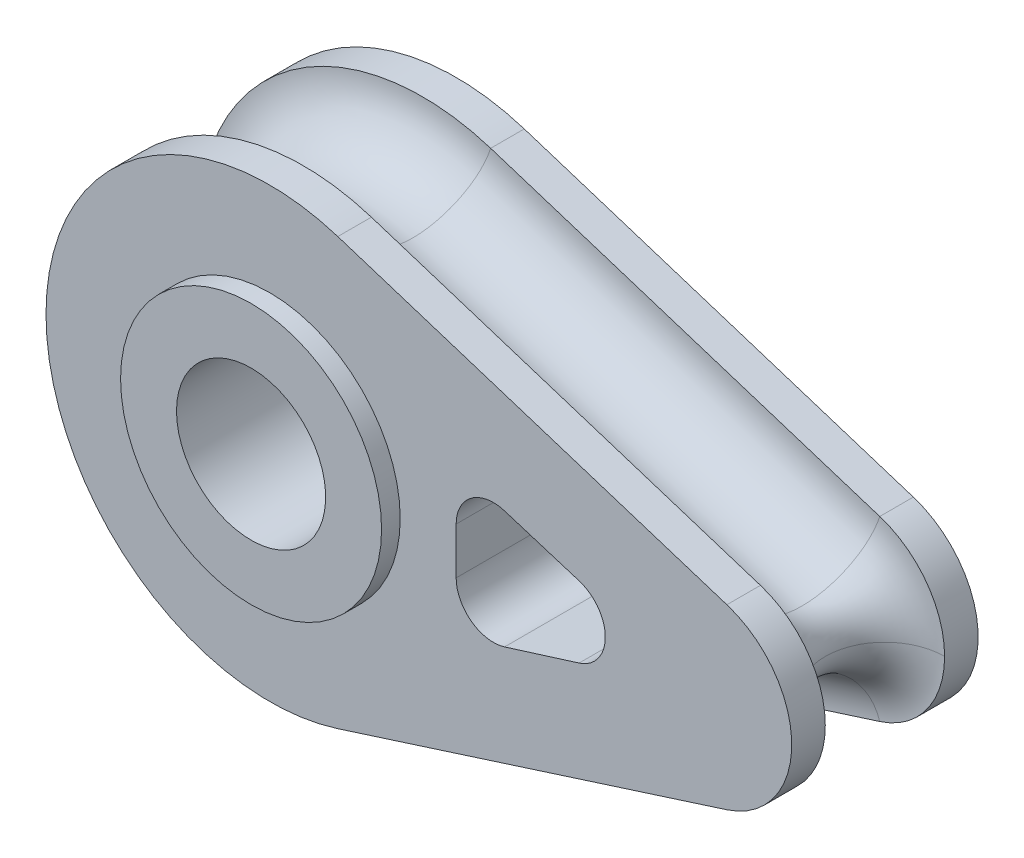
ISO-10303-21;
HEADER;
FILE_DESCRIPTION(('STEP AP214'),'2;1');
FILE_NAME('part.step','',(''),(''),'','','');
FILE_SCHEMA(('AUTOMOTIVE_DESIGN { 1 0 10303 214 1 1 1 1 }'));
ENDSEC;
DATA;
#1=APPLICATION_CONTEXT('core data for automotive mechanical design processes');
#2=APPLICATION_PROTOCOL_DEFINITION('international standard','automotive_design',2000,#1);
#3=PRODUCT_CONTEXT('',#1,'mechanical');
#4=PRODUCT('Part','Part','',(#3));
#5=PRODUCT_RELATED_PRODUCT_CATEGORY('part','',(#4));
#6=PRODUCT_DEFINITION_FORMATION('','',#4);
#7=PRODUCT_DEFINITION_CONTEXT('part definition',#1,'design');
#8=PRODUCT_DEFINITION('design','',#6,#7);
#9=PRODUCT_DEFINITION_SHAPE('','',#8);
#10=(LENGTH_UNIT() NAMED_UNIT(*) SI_UNIT(.MILLI.,.METRE.));
#11=(NAMED_UNIT(*) PLANE_ANGLE_UNIT() SI_UNIT($,.RADIAN.));
#12=(NAMED_UNIT(*) SI_UNIT($,.STERADIAN.) SOLID_ANGLE_UNIT());
#13=UNCERTAINTY_MEASURE_WITH_UNIT(LENGTH_MEASURE(1.E-05),#10,'distance_accuracy_value','');
#14=(GEOMETRIC_REPRESENTATION_CONTEXT(3) GLOBAL_UNCERTAINTY_ASSIGNED_CONTEXT((#13)) GLOBAL_UNIT_ASSIGNED_CONTEXT((#10,
#11,#12)) REPRESENTATION_CONTEXT('',''));
#15=CARTESIAN_POINT('',(0.,0.,0.));
#16=DIRECTION('',(0.,0.,1.));
#17=DIRECTION('',(1.,0.,0.));
#18=AXIS2_PLACEMENT_3D('',#15,#16,#17);
#19=CARTESIAN_POINT('',(0.,0.,50.));
#20=DIRECTION('',(0.,0.,-1.));
#21=DIRECTION('',(-1.,0.,0.));
#22=AXIS2_PLACEMENT_3D('',#19,#20,#21);
#23=CYLINDRICAL_SURFACE('',#22,60.);
#24=CARTESIAN_POINT('',(0.,0.,41.));
#25=DIRECTION('',(0.,0.,-1.));
#26=DIRECTION('',(-1.,0.,0.));
#27=AXIS2_PLACEMENT_3D('',#24,#25,#26);
#28=CIRCLE('',#27,60.);
#29=CARTESIAN_POINT('',(18.2608695652174,-57.1536581744521,41.));
#30=VERTEX_POINT('',#29);
#31=CARTESIAN_POINT('',(18.2608695652174,57.1536581744521,41.));
#32=VERTEX_POINT('',#31);
#33=EDGE_CURVE('E153',#30,#32,#28,.T.);
#34=ORIENTED_EDGE('',*,*,#33,.F.);
#35=DIRECTION('',(0.,0.,-1.));
#36=VECTOR('',#35,1.);
#37=CARTESIAN_POINT('',(18.2608695652174,-57.1536581744521,50.));
#38=LINE('',#37,#36);
#39=CARTESIAN_POINT('',(18.2608695652174,-57.1536581744521,50.));
#40=VERTEX_POINT('',#39);
#41=EDGE_CURVE('E178',#40,#30,#38,.T.);
#42=ORIENTED_EDGE('',*,*,#41,.F.);
#43=CARTESIAN_POINT('',(0.,0.,50.));
#44=DIRECTION('',(0.,0.,1.));
#45=DIRECTION('',(1.,0.,0.));
#46=AXIS2_PLACEMENT_3D('',#43,#44,#45);
#47=CIRCLE('',#46,60.);
#48=CARTESIAN_POINT('',(18.2608695652174,57.1536581744521,50.));
#49=VERTEX_POINT('',#48);
#50=EDGE_CURVE('E237',#49,#40,#47,.T.);
#51=ORIENTED_EDGE('',*,*,#50,.F.);
#52=DIRECTION('',(0.,0.,-1.));
#53=VECTOR('',#52,1.);
#54=CARTESIAN_POINT('',(18.2608695652174,57.1536581744521,50.));
#55=LINE('',#54,#53);
#56=EDGE_CURVE('E255',#49,#32,#55,.T.);
#57=ORIENTED_EDGE('',*,*,#56,.T.);
#58=EDGE_LOOP('',(#34,#42,#51,#57));
#59=FACE_BOUND('',#58,.T.);
#60=ADVANCED_FACE('F39',(#59),#23,.T.);
#61=CARTESIAN_POINT('',(0.,0.,9.00000000000001));
#62=DIRECTION('',(0.,0.,1.));
#63=DIRECTION('',(1.,0.,0.));
#64=AXIS2_PLACEMENT_3D('',#61,#62,#63);
#65=CIRCLE('',#64,60.);
#66=CARTESIAN_POINT('',(18.2608695652174,57.1536581744521,9.00000000000001));
#67=VERTEX_POINT('',#66);
#68=CARTESIAN_POINT('',(18.2608695652174,-57.1536581744521,9.00000000000001));
#69=VERTEX_POINT('',#68);
#70=EDGE_CURVE('E144',#67,#69,#65,.T.);
#71=ORIENTED_EDGE('',*,*,#70,.F.);
#72=CARTESIAN_POINT('',(18.2608695652174,57.1536581744521,0.));
#73=VERTEX_POINT('',#72);
#74=EDGE_CURVE('E235',#67,#73,#55,.T.);
#75=ORIENTED_EDGE('',*,*,#74,.T.);
#76=CARTESIAN_POINT('',(0.,0.,0.));
#77=DIRECTION('',(0.,0.,1.));
#78=DIRECTION('',(1.,0.,0.));
#79=AXIS2_PLACEMENT_3D('',#76,#77,#78);
#80=CIRCLE('',#79,60.);
#81=CARTESIAN_POINT('',(18.2608695652174,-57.1536581744521,0.));
#82=VERTEX_POINT('',#81);
#83=EDGE_CURVE('E176',#73,#82,#80,.T.);
#84=ORIENTED_EDGE('',*,*,#83,.T.);
#85=EDGE_CURVE('E168',#69,#82,#38,.T.);
#86=ORIENTED_EDGE('',*,*,#85,.F.);
#87=EDGE_LOOP('',(#71,#75,#84,#86));
#88=FACE_BOUND('',#87,.T.);
#89=ADVANCED_FACE('F174',(#88),#23,.T.);
#90=CARTESIAN_POINT('',(18.2608695652174,-57.1536581744521,50.));
#91=DIRECTION('',(-0.304347826086957,0.952560969574202,0.));
#92=DIRECTION('',(-0.952560969574202,-0.304347826086957,0.));
#93=AXIS2_PLACEMENT_3D('',#90,#91,#92);
#94=PLANE('',#93);
#95=DIRECTION('',(0.952560969574202,0.304347826086957,0.));
#96=VECTOR('',#95,1.);
#97=CARTESIAN_POINT('',(18.2608695652173,-57.1536581744521,41.));
#98=LINE('',#97,#96);
#99=CARTESIAN_POINT('',(122.608695652174,-23.814024239355,41.));
#100=VERTEX_POINT('',#99);
#101=EDGE_CURVE('E11',#100,#30,#98,.F.);
#102=ORIENTED_EDGE('',*,*,#101,.F.);
#103=DIRECTION('',(0.,0.,-1.));
#104=VECTOR('',#103,1.);
#105=CARTESIAN_POINT('',(122.608695652174,-23.814024239355,50.));
#106=LINE('',#105,#104);
#107=CARTESIAN_POINT('',(122.608695652174,-23.814024239355,50.));
#108=VERTEX_POINT('',#107);
#109=EDGE_CURVE('E179',#108,#100,#106,.T.);
#110=ORIENTED_EDGE('',*,*,#109,.F.);
#111=DIRECTION('',(0.952560969574202,0.304347826086957,0.));
#112=VECTOR('',#111,1.);
#113=CARTESIAN_POINT('',(18.2608695652174,-57.1536581744521,50.));
#114=LINE('',#113,#112);
#115=EDGE_CURVE('E231',#40,#108,#114,.T.);
#116=ORIENTED_EDGE('',*,*,#115,.F.);
#117=ORIENTED_EDGE('',*,*,#41,.T.);
#118=EDGE_LOOP('',(#102,#110,#116,#117));
#119=FACE_BOUND('',#118,.T.);
#120=ADVANCED_FACE('F219',(#119),#94,.F.);
#121=DIRECTION('',(0.952560969574202,0.304347826086957,0.));
#122=VECTOR('',#121,1.);
#123=CARTESIAN_POINT('',(18.2608695652173,-57.1536581744521,9.00000000000001));
#124=LINE('',#123,#122);
#125=CARTESIAN_POINT('',(122.608695652174,-23.814024239355,9.00000000000001));
#126=VERTEX_POINT('',#125);
#127=EDGE_CURVE('E47',#69,#126,#124,.T.);
#128=ORIENTED_EDGE('',*,*,#127,.F.);
#129=ORIENTED_EDGE('',*,*,#85,.T.);
#130=DIRECTION('',(0.952560969574202,0.304347826086957,0.));
#131=VECTOR('',#130,1.);
#132=CARTESIAN_POINT('',(18.2608695652174,-57.1536581744521,0.));
#133=LINE('',#132,#131);
#134=CARTESIAN_POINT('',(122.608695652174,-23.814024239355,0.));
#135=VERTEX_POINT('',#134);
#136=EDGE_CURVE('E243',#82,#135,#133,.T.);
#137=ORIENTED_EDGE('',*,*,#136,.T.);
#138=EDGE_CURVE('E170',#126,#135,#106,.T.);
#139=ORIENTED_EDGE('',*,*,#138,.F.);
#140=EDGE_LOOP('',(#128,#129,#137,#139));
#141=FACE_BOUND('',#140,.T.);
#142=ADVANCED_FACE('F166',(#141),#94,.F.);
#143=CARTESIAN_POINT('',(115.,0.,50.));
#144=DIRECTION('',(0.,0.,-1.));
#145=DIRECTION('',(-1.,0.,0.));
#146=AXIS2_PLACEMENT_3D('',#143,#144,#145);
#147=CYLINDRICAL_SURFACE('',#146,25.);
#148=CARTESIAN_POINT('',(115.,0.,41.));
#149=DIRECTION('',(0.,0.,-1.));
#150=DIRECTION('',(-1.,0.,0.));
#151=AXIS2_PLACEMENT_3D('',#148,#149,#150);
#152=CIRCLE('',#151,25.);
#153=CARTESIAN_POINT('',(122.608695652174,23.814024239355,41.));
#154=VERTEX_POINT('',#153);
#155=CARTESIAN_POINT('',(140.,0.,41.));
#156=VERTEX_POINT('',#155);
#157=EDGE_CURVE('E311',#154,#156,#152,.T.);
#158=ORIENTED_EDGE('',*,*,#157,.F.);
#159=DIRECTION('',(0.,0.,-1.));
#160=VECTOR('',#159,1.);
#161=CARTESIAN_POINT('',(122.608695652174,23.814024239355,50.));
#162=LINE('',#161,#160);
#163=CARTESIAN_POINT('',(122.608695652174,23.814024239355,50.));
#164=VERTEX_POINT('',#163);
#165=EDGE_CURVE('E226',#164,#154,#162,.T.);
#166=ORIENTED_EDGE('',*,*,#165,.F.);
#167=CARTESIAN_POINT('',(115.,0.,50.));
#168=DIRECTION('',(0.,0.,1.));
#169=DIRECTION('',(1.,0.,0.));
#170=AXIS2_PLACEMENT_3D('',#167,#168,#169);
#171=CIRCLE('',#170,25.);
#172=EDGE_CURVE('E224',#108,#164,#171,.T.);
#173=ORIENTED_EDGE('',*,*,#172,.F.);
#174=ORIENTED_EDGE('',*,*,#109,.T.);
#175=CARTESIAN_POINT('',(115.,0.,41.));
#176=DIRECTION('',(0.,0.,-1.));
#177=DIRECTION('',(-1.,0.,0.));
#178=AXIS2_PLACEMENT_3D('',#175,#176,#177);
#179=CIRCLE('',#178,25.);
#180=EDGE_CURVE('E172',#156,#100,#179,.T.);
#181=ORIENTED_EDGE('',*,*,#180,.F.);
#182=EDGE_LOOP('',(#158,#166,#173,#174,#181));
#183=FACE_BOUND('',#182,.T.);
#184=ADVANCED_FACE('F222',(#183),#147,.T.);
#185=CARTESIAN_POINT('',(115.,0.,9.00000000000001));
#186=DIRECTION('',(0.,0.,1.));
#187=DIRECTION('',(1.,0.,0.));
#188=AXIS2_PLACEMENT_3D('',#185,#186,#187);
#189=CIRCLE('',#188,25.);
#190=CARTESIAN_POINT('',(140.,0.,9.00000000000001));
#191=VERTEX_POINT('',#190);
#192=CARTESIAN_POINT('',(122.608695652174,23.814024239355,9.00000000000001));
#193=VERTEX_POINT('',#192);
#194=EDGE_CURVE('E308',#191,#193,#189,.T.);
#195=ORIENTED_EDGE('',*,*,#194,.F.);
#196=CARTESIAN_POINT('',(115.,0.,9.00000000000001));
#197=DIRECTION('',(0.,0.,1.));
#198=DIRECTION('',(1.,0.,0.));
#199=AXIS2_PLACEMENT_3D('',#196,#197,#198);
#200=CIRCLE('',#199,25.);
#201=EDGE_CURVE('E202',#126,#191,#200,.T.);
#202=ORIENTED_EDGE('',*,*,#201,.F.);
#203=ORIENTED_EDGE('',*,*,#138,.T.);
#204=CARTESIAN_POINT('',(115.,0.,0.));
#205=DIRECTION('',(0.,0.,1.));
#206=DIRECTION('',(1.,0.,0.));
#207=AXIS2_PLACEMENT_3D('',#204,#205,#206);
#208=CIRCLE('',#207,25.);
#209=CARTESIAN_POINT('',(122.608695652174,23.814024239355,0.));
#210=VERTEX_POINT('',#209);
#211=EDGE_CURVE('E247',#135,#210,#208,.T.);
#212=ORIENTED_EDGE('',*,*,#211,.T.);
#213=EDGE_CURVE('E258',#193,#210,#162,.T.);
#214=ORIENTED_EDGE('',*,*,#213,.F.);
#215=EDGE_LOOP('',(#195,#202,#203,#212,#214));
#216=FACE_BOUND('',#215,.T.);
#217=ADVANCED_FACE('F272',(#216),#147,.T.);
#218=CARTESIAN_POINT('',(18.2608695652174,57.1536581744521,50.));
#219=DIRECTION('',(-0.304347826086957,-0.952560969574202,0.));
#220=DIRECTION('',(0.952560969574202,-0.304347826086957,0.));
#221=AXIS2_PLACEMENT_3D('',#218,#219,#220);
#222=PLANE('',#221);
#223=DIRECTION('',(-0.952560969574202,0.304347826086956,0.));
#224=VECTOR('',#223,1.);
#225=CARTESIAN_POINT('',(122.608695652174,23.814024239355,41.));
#226=LINE('',#225,#224);
#227=EDGE_CURVE('E199',#32,#154,#226,.F.);
#228=ORIENTED_EDGE('',*,*,#227,.F.);
#229=ORIENTED_EDGE('',*,*,#56,.F.);
#230=DIRECTION('',(-0.952560969574202,0.304347826086957,0.));
#231=VECTOR('',#230,1.);
#232=CARTESIAN_POINT('',(18.2608695652174,57.1536581744521,50.));
#233=LINE('',#232,#231);
#234=EDGE_CURVE('E230',#164,#49,#233,.T.);
#235=ORIENTED_EDGE('',*,*,#234,.F.);
#236=ORIENTED_EDGE('',*,*,#165,.T.);
#237=EDGE_LOOP('',(#228,#229,#235,#236));
#238=FACE_BOUND('',#237,.T.);
#239=ADVANCED_FACE('F395',(#238),#222,.F.);
#240=DIRECTION('',(-0.952560969574202,0.304347826086956,0.));
#241=VECTOR('',#240,1.);
#242=CARTESIAN_POINT('',(122.608695652174,23.814024239355,9.00000000000001));
#243=LINE('',#242,#241);
#244=EDGE_CURVE('E196',#193,#67,#243,.T.);
#245=ORIENTED_EDGE('',*,*,#244,.F.);
#246=ORIENTED_EDGE('',*,*,#213,.T.);
#247=DIRECTION('',(-0.952560969574202,0.304347826086957,0.));
#248=VECTOR('',#247,1.);
#249=CARTESIAN_POINT('',(18.2608695652174,57.1536581744521,0.));
#250=LINE('',#249,#248);
#251=EDGE_CURVE('E251',#210,#73,#250,.T.);
#252=ORIENTED_EDGE('',*,*,#251,.T.);
#253=ORIENTED_EDGE('',*,*,#74,.F.);
#254=EDGE_LOOP('',(#245,#246,#252,#253));
#255=FACE_BOUND('',#254,.T.);
#256=ADVANCED_FACE('F267',(#255),#222,.F.);
#257=CARTESIAN_POINT('',(0.,0.,0.));
#258=DIRECTION('',(0.,0.,1.));
#259=DIRECTION('',(1.,0.,0.));
#260=AXIS2_PLACEMENT_3D('',#257,#258,#259);
#261=PLANE('',#260);
#262=CARTESIAN_POINT('',(60.,-6.25000000000001,0.));
#263=DIRECTION('',(0.,0.,1.));
#264=DIRECTION('',(1.,0.,0.));
#265=AXIS2_PLACEMENT_3D('',#262,#263,#264);
#266=CIRCLE('',#265,10.);
#267=CARTESIAN_POINT('',(50.,-6.25000000000001,0.));
#268=VERTEX_POINT('',#267);
#269=CARTESIAN_POINT('',(62.9827499313595,-15.7947997803503,0.));
#270=VERTEX_POINT('',#269);
#271=EDGE_CURVE('E332',#268,#270,#266,.T.);
#272=ORIENTED_EDGE('',*,*,#271,.T.);
#273=DIRECTION('',(0.95447997803503,0.298274993135947,0.));
#274=VECTOR('',#273,1.);
#275=CARTESIAN_POINT('',(62.9827499313595,-15.7947997803503,0.));
#276=LINE('',#275,#274);
#277=CARTESIAN_POINT('',(82.9827499313595,-9.5447997803503,0.));
#278=VERTEX_POINT('',#277);
#279=EDGE_CURVE('E357',#270,#278,#276,.T.);
#280=ORIENTED_EDGE('',*,*,#279,.T.);
#281=CARTESIAN_POINT('',(80.,0.,0.));
#282=DIRECTION('',(0.,0.,1.));
#283=DIRECTION('',(1.,0.,0.));
#284=AXIS2_PLACEMENT_3D('',#281,#282,#283);
#285=CIRCLE('',#284,10.);
#286=CARTESIAN_POINT('',(82.9827499313595,9.54479978035029,0.));
#287=VERTEX_POINT('',#286);
#288=EDGE_CURVE('E361',#278,#287,#285,.T.);
#289=ORIENTED_EDGE('',*,*,#288,.T.);
#290=DIRECTION('',(-0.95447997803503,0.298274993135947,0.));
#291=VECTOR('',#290,1.);
#292=CARTESIAN_POINT('',(62.9827499313595,15.7947997803503,0.));
#293=LINE('',#292,#291);
#294=CARTESIAN_POINT('',(62.9827499313595,15.7947997803503,0.));
#295=VERTEX_POINT('',#294);
#296=EDGE_CURVE('E365',#287,#295,#293,.T.);
#297=ORIENTED_EDGE('',*,*,#296,.T.);
#298=CARTESIAN_POINT('',(60.,6.24999999999999,0.));
#299=DIRECTION('',(0.,0.,1.));
#300=DIRECTION('',(1.,0.,0.));
#301=AXIS2_PLACEMENT_3D('',#298,#299,#300);
#302=CIRCLE('',#301,10.);
#303=CARTESIAN_POINT('',(50.,6.24999999999999,0.));
#304=VERTEX_POINT('',#303);
#305=EDGE_CURVE('E369',#295,#304,#302,.T.);
#306=ORIENTED_EDGE('',*,*,#305,.T.);
#307=DIRECTION('',(0.,-1.,0.));
#308=VECTOR('',#307,1.);
#309=CARTESIAN_POINT('',(50.,-6.25000000000001,0.));
#310=LINE('',#309,#308);
#311=EDGE_CURVE('E337',#304,#268,#310,.T.);
#312=ORIENTED_EDGE('',*,*,#311,.T.);
#313=EDGE_LOOP('',(#272,#280,#289,#297,#306,#312));
#314=FACE_BOUND('',#313,.T.);
#315=ORIENTED_EDGE('',*,*,#83,.F.);
#316=ORIENTED_EDGE('',*,*,#251,.F.);
#317=ORIENTED_EDGE('',*,*,#211,.F.);
#318=ORIENTED_EDGE('',*,*,#136,.F.);
#319=EDGE_LOOP('',(#315,#316,#317,#318));
#320=FACE_BOUND('',#319,.T.);
#321=CARTESIAN_POINT('',(0.,0.,0.));
#322=DIRECTION('',(0.,0.,1.));
#323=DIRECTION('',(1.,0.,0.));
#324=AXIS2_PLACEMENT_3D('',#321,#322,#323);
#325=CIRCLE('',#324,35.);
#326=CARTESIAN_POINT('',(35.,0.,0.));
#327=VERTEX_POINT('',#326);
#328=EDGE_CURVE('E184',#327,#327,#325,.F.);
#329=ORIENTED_EDGE('',*,*,#328,.F.);
#330=EDGE_LOOP('',(#329));
#331=FACE_BOUND('',#330,.T.);
#332=ADVANCED_FACE('F274',(#314,#320,#331),#261,.F.);
#333=CARTESIAN_POINT('',(0.,0.,50.));
#334=DIRECTION('',(0.,0.,1.));
#335=DIRECTION('',(1.,0.,0.));
#336=AXIS2_PLACEMENT_3D('',#333,#334,#335);
#337=PLANE('',#336);
#338=CARTESIAN_POINT('',(0.,0.,50.));
#339=DIRECTION('',(0.,0.,1.));
#340=DIRECTION('',(1.,0.,0.));
#341=AXIS2_PLACEMENT_3D('',#338,#339,#340);
#342=CIRCLE('',#341,35.);
#343=CARTESIAN_POINT('',(35.,0.,50.));
#344=VERTEX_POINT('',#343);
#345=EDGE_CURVE('E192',#344,#344,#342,.T.);
#346=ORIENTED_EDGE('',*,*,#345,.F.);
#347=EDGE_LOOP('',(#346));
#348=FACE_BOUND('',#347,.T.);
#349=DIRECTION('',(0.95447997803503,0.298274993135947,0.));
#350=VECTOR('',#349,1.);
#351=CARTESIAN_POINT('',(62.9827499313595,-15.7947997803503,50.));
#352=LINE('',#351,#350);
#353=CARTESIAN_POINT('',(62.9827499313595,-15.7947997803503,50.));
#354=VERTEX_POINT('',#353);
#355=CARTESIAN_POINT('',(82.9827499313595,-9.5447997803503,50.));
#356=VERTEX_POINT('',#355);
#357=EDGE_CURVE('E336',#354,#356,#352,.T.);
#358=ORIENTED_EDGE('',*,*,#357,.F.);
#359=CARTESIAN_POINT('',(60.,-6.25000000000001,50.));
#360=DIRECTION('',(0.,0.,1.));
#361=DIRECTION('',(1.,0.,0.));
#362=AXIS2_PLACEMENT_3D('',#359,#360,#361);
#363=CIRCLE('',#362,10.);
#364=CARTESIAN_POINT('',(50.,-6.25000000000001,50.));
#365=VERTEX_POINT('',#364);
#366=EDGE_CURVE('E333',#365,#354,#363,.T.);
#367=ORIENTED_EDGE('',*,*,#366,.F.);
#368=DIRECTION('',(0.,-1.,0.));
#369=VECTOR('',#368,1.);
#370=CARTESIAN_POINT('',(50.,-6.25000000000001,50.));
#371=LINE('',#370,#369);
#372=CARTESIAN_POINT('',(50.,6.24999999999999,50.));
#373=VERTEX_POINT('',#372);
#374=EDGE_CURVE('E350',#373,#365,#371,.T.);
#375=ORIENTED_EDGE('',*,*,#374,.F.);
#376=CARTESIAN_POINT('',(60.,6.24999999999999,50.));
#377=DIRECTION('',(0.,0.,1.));
#378=DIRECTION('',(1.,0.,0.));
#379=AXIS2_PLACEMENT_3D('',#376,#377,#378);
#380=CIRCLE('',#379,10.);
#381=CARTESIAN_POINT('',(62.9827499313595,15.7947997803503,50.));
#382=VERTEX_POINT('',#381);
#383=EDGE_CURVE('E346',#382,#373,#380,.T.);
#384=ORIENTED_EDGE('',*,*,#383,.F.);
#385=DIRECTION('',(-0.95447997803503,0.298274993135947,0.));
#386=VECTOR('',#385,1.);
#387=CARTESIAN_POINT('',(62.9827499313595,15.7947997803503,50.));
#388=LINE('',#387,#386);
#389=CARTESIAN_POINT('',(82.9827499313595,9.54479978035029,50.));
#390=VERTEX_POINT('',#389);
#391=EDGE_CURVE('E343',#390,#382,#388,.T.);
#392=ORIENTED_EDGE('',*,*,#391,.F.);
#393=CARTESIAN_POINT('',(80.,0.,50.));
#394=DIRECTION('',(0.,0.,1.));
#395=DIRECTION('',(1.,0.,0.));
#396=AXIS2_PLACEMENT_3D('',#393,#394,#395);
#397=CIRCLE('',#396,10.);
#398=EDGE_CURVE('E340',#356,#390,#397,.T.);
#399=ORIENTED_EDGE('',*,*,#398,.F.);
#400=EDGE_LOOP('',(#358,#367,#375,#384,#392,#399));
#401=FACE_BOUND('',#400,.T.);
#402=ORIENTED_EDGE('',*,*,#50,.T.);
#403=ORIENTED_EDGE('',*,*,#115,.T.);
#404=ORIENTED_EDGE('',*,*,#172,.T.);
#405=ORIENTED_EDGE('',*,*,#234,.T.);
#406=EDGE_LOOP('',(#402,#403,#404,#405));
#407=FACE_BOUND('',#406,.T.);
#408=ADVANCED_FACE('F277',(#348,#401,#407),#337,.T.);
#409=CARTESIAN_POINT('',(60.,-6.25000000000001,50.));
#410=DIRECTION('',(0.,0.,-1.));
#411=DIRECTION('',(-1.,0.,0.));
#412=AXIS2_PLACEMENT_3D('',#409,#410,#411);
#413=CYLINDRICAL_SURFACE('',#412,10.);
#414=ORIENTED_EDGE('',*,*,#271,.F.);
#415=DIRECTION('',(0.,0.,-1.));
#416=VECTOR('',#415,1.);
#417=CARTESIAN_POINT('',(50.,-6.25000000000001,50.));
#418=LINE('',#417,#416);
#419=EDGE_CURVE('E353',#365,#268,#418,.T.);
#420=ORIENTED_EDGE('',*,*,#419,.F.);
#421=ORIENTED_EDGE('',*,*,#366,.T.);
#422=DIRECTION('',(0.,0.,-1.));
#423=VECTOR('',#422,1.);
#424=CARTESIAN_POINT('',(62.9827499313595,-15.7947997803503,50.));
#425=LINE('',#424,#423);
#426=EDGE_CURVE('E244',#354,#270,#425,.T.);
#427=ORIENTED_EDGE('',*,*,#426,.T.);
#428=EDGE_LOOP('',(#414,#420,#421,#427));
#429=FACE_BOUND('',#428,.T.);
#430=ADVANCED_FACE('F430',(#429),#413,.F.);
#431=CARTESIAN_POINT('',(62.9827499313595,-15.7947997803503,50.));
#432=DIRECTION('',(-0.298274993135947,0.95447997803503,0.));
#433=DIRECTION('',(-0.95447997803503,-0.298274993135947,0.));
#434=AXIS2_PLACEMENT_3D('',#431,#432,#433);
#435=PLANE('',#434);
#436=ORIENTED_EDGE('',*,*,#279,.F.);
#437=ORIENTED_EDGE('',*,*,#426,.F.);
#438=ORIENTED_EDGE('',*,*,#357,.T.);
#439=DIRECTION('',(0.,0.,-1.));
#440=VECTOR('',#439,1.);
#441=CARTESIAN_POINT('',(82.9827499313595,-9.5447997803503,50.));
#442=LINE('',#441,#440);
#443=EDGE_CURVE('E388',#356,#278,#442,.T.);
#444=ORIENTED_EDGE('',*,*,#443,.T.);
#445=EDGE_LOOP('',(#436,#437,#438,#444));
#446=FACE_BOUND('',#445,.T.);
#447=ADVANCED_FACE('F440',(#446),#435,.T.);
#448=CARTESIAN_POINT('',(80.,0.,50.));
#449=DIRECTION('',(0.,0.,-1.));
#450=DIRECTION('',(-1.,0.,0.));
#451=AXIS2_PLACEMENT_3D('',#448,#449,#450);
#452=CYLINDRICAL_SURFACE('',#451,10.);
#453=ORIENTED_EDGE('',*,*,#288,.F.);
#454=ORIENTED_EDGE('',*,*,#443,.F.);
#455=ORIENTED_EDGE('',*,*,#398,.T.);
#456=DIRECTION('',(0.,0.,-1.));
#457=VECTOR('',#456,1.);
#458=CARTESIAN_POINT('',(82.9827499313595,9.54479978035029,50.));
#459=LINE('',#458,#457);
#460=EDGE_CURVE('E385',#390,#287,#459,.T.);
#461=ORIENTED_EDGE('',*,*,#460,.T.);
#462=EDGE_LOOP('',(#453,#454,#455,#461));
#463=FACE_BOUND('',#462,.T.);
#464=ADVANCED_FACE('F443',(#463),#452,.F.);
#465=CARTESIAN_POINT('',(62.9827499313595,15.7947997803503,50.));
#466=DIRECTION('',(-0.298274993135947,-0.95447997803503,0.));
#467=DIRECTION('',(0.95447997803503,-0.298274993135947,0.));
#468=AXIS2_PLACEMENT_3D('',#465,#466,#467);
#469=PLANE('',#468);
#470=ORIENTED_EDGE('',*,*,#296,.F.);
#471=ORIENTED_EDGE('',*,*,#460,.F.);
#472=ORIENTED_EDGE('',*,*,#391,.T.);
#473=DIRECTION('',(0.,0.,-1.));
#474=VECTOR('',#473,1.);
#475=CARTESIAN_POINT('',(62.9827499313595,15.7947997803503,50.));
#476=LINE('',#475,#474);
#477=EDGE_CURVE('E382',#382,#295,#476,.T.);
#478=ORIENTED_EDGE('',*,*,#477,.T.);
#479=EDGE_LOOP('',(#470,#471,#472,#478));
#480=FACE_BOUND('',#479,.T.);
#481=ADVANCED_FACE('F457',(#480),#469,.T.);
#482=CARTESIAN_POINT('',(60.,6.24999999999999,50.));
#483=DIRECTION('',(0.,0.,-1.));
#484=DIRECTION('',(-1.,0.,0.));
#485=AXIS2_PLACEMENT_3D('',#482,#483,#484);
#486=CYLINDRICAL_SURFACE('',#485,10.);
#487=ORIENTED_EDGE('',*,*,#305,.F.);
#488=ORIENTED_EDGE('',*,*,#477,.F.);
#489=ORIENTED_EDGE('',*,*,#383,.T.);
#490=DIRECTION('',(0.,0.,-1.));
#491=VECTOR('',#490,1.);
#492=CARTESIAN_POINT('',(50.,6.24999999999999,50.));
#493=LINE('',#492,#491);
#494=EDGE_CURVE('E379',#373,#304,#493,.T.);
#495=ORIENTED_EDGE('',*,*,#494,.T.);
#496=EDGE_LOOP('',(#487,#488,#489,#495));
#497=FACE_BOUND('',#496,.T.);
#498=ADVANCED_FACE('F454',(#497),#486,.F.);
#499=CARTESIAN_POINT('',(50.,-6.25000000000001,50.));
#500=DIRECTION('',(1.,0.,0.));
#501=DIRECTION('',(0.,0.,-1.));
#502=AXIS2_PLACEMENT_3D('',#499,#500,#501);
#503=PLANE('',#502);
#504=ORIENTED_EDGE('',*,*,#311,.F.);
#505=ORIENTED_EDGE('',*,*,#494,.F.);
#506=ORIENTED_EDGE('',*,*,#374,.T.);
#507=ORIENTED_EDGE('',*,*,#419,.T.);
#508=EDGE_LOOP('',(#504,#505,#506,#507));
#509=FACE_BOUND('',#508,.T.);
#510=ADVANCED_FACE('F450',(#509),#503,.T.);
#511=CARTESIAN_POINT('',(0.,0.,50.));
#512=DIRECTION('',(0.,0.,-1.));
#513=DIRECTION('',(-1.,0.,0.));
#514=AXIS2_PLACEMENT_3D('',#511,#512,#513);
#515=CYLINDRICAL_SURFACE('',#514,20.);
#516=CARTESIAN_POINT('',(0.,0.,-5.));
#517=DIRECTION('',(0.,0.,-1.));
#518=DIRECTION('',(-1.,0.,0.));
#519=AXIS2_PLACEMENT_3D('',#516,#517,#518);
#520=CIRCLE('',#519,20.);
#521=CARTESIAN_POINT('',(-20.,0.,-5.));
#522=VERTEX_POINT('',#521);
#523=EDGE_CURVE('E324',#522,#522,#520,.T.);
#524=ORIENTED_EDGE('',*,*,#523,.T.);
#525=EDGE_LOOP('',(#524));
#526=FACE_BOUND('',#525,.T.);
#527=CARTESIAN_POINT('',(0.,0.,55.));
#528=DIRECTION('',(0.,0.,-1.));
#529=DIRECTION('',(-1.,0.,0.));
#530=AXIS2_PLACEMENT_3D('',#527,#528,#529);
#531=CIRCLE('',#530,20.);
#532=CARTESIAN_POINT('',(-20.,0.,55.));
#533=VERTEX_POINT('',#532);
#534=EDGE_CURVE('E316',#533,#533,#531,.T.);
#535=ORIENTED_EDGE('',*,*,#534,.F.);
#536=EDGE_LOOP('',(#535));
#537=FACE_BOUND('',#536,.T.);
#538=ADVANCED_FACE('F295',(#526,#537),#515,.F.);
#539=CARTESIAN_POINT('',(0.,0.,-5.));
#540=DIRECTION('',(0.,0.,-1.));
#541=DIRECTION('',(-1.,0.,0.));
#542=AXIS2_PLACEMENT_3D('',#539,#540,#541);
#543=PLANE('',#542);
#544=CARTESIAN_POINT('',(0.,0.,-5.));
#545=DIRECTION('',(0.,0.,-1.));
#546=DIRECTION('',(-1.,0.,0.));
#547=AXIS2_PLACEMENT_3D('',#544,#545,#546);
#548=CIRCLE('',#547,35.);
#549=CARTESIAN_POINT('',(-35.,0.,-5.));
#550=VERTEX_POINT('',#549);
#551=EDGE_CURVE('E328',#550,#550,#548,.T.);
#552=ORIENTED_EDGE('',*,*,#551,.T.);
#553=EDGE_LOOP('',(#552));
#554=FACE_BOUND('',#553,.T.);
#555=ORIENTED_EDGE('',*,*,#523,.F.);
#556=EDGE_LOOP('',(#555));
#557=FACE_BOUND('',#556,.T.);
#558=ADVANCED_FACE('F285',(#554,#557),#543,.T.);
#559=CARTESIAN_POINT('',(0.,0.,-5.));
#560=DIRECTION('',(0.,0.,1.));
#561=DIRECTION('',(1.,0.,0.));
#562=AXIS2_PLACEMENT_3D('',#559,#560,#561);
#563=CYLINDRICAL_SURFACE('',#562,35.);
#564=ORIENTED_EDGE('',*,*,#551,.F.);
#565=EDGE_LOOP('',(#564));
#566=FACE_BOUND('',#565,.T.);
#567=ORIENTED_EDGE('',*,*,#328,.T.);
#568=EDGE_LOOP('',(#567));
#569=FACE_BOUND('',#568,.T.);
#570=ADVANCED_FACE('F282',(#566,#569),#563,.T.);
#571=CARTESIAN_POINT('',(0.,0.,55.));
#572=DIRECTION('',(0.,0.,-1.));
#573=DIRECTION('',(-1.,0.,0.));
#574=AXIS2_PLACEMENT_3D('',#571,#572,#573);
#575=CYLINDRICAL_SURFACE('',#574,35.);
#576=CARTESIAN_POINT('',(0.,0.,55.));
#577=DIRECTION('',(0.,0.,-1.));
#578=DIRECTION('',(-1.,0.,0.));
#579=AXIS2_PLACEMENT_3D('',#576,#577,#578);
#580=CIRCLE('',#579,35.);
#581=CARTESIAN_POINT('',(-35.,0.,55.));
#582=VERTEX_POINT('',#581);
#583=EDGE_CURVE('E320',#582,#582,#580,.T.);
#584=ORIENTED_EDGE('',*,*,#583,.T.);
#585=EDGE_LOOP('',(#584));
#586=FACE_BOUND('',#585,.T.);
#587=ORIENTED_EDGE('',*,*,#345,.T.);
#588=EDGE_LOOP('',(#587));
#589=FACE_BOUND('',#588,.T.);
#590=ADVANCED_FACE('F284',(#586,#589),#575,.T.);
#591=CARTESIAN_POINT('',(0.,0.,55.));
#592=DIRECTION('',(0.,0.,1.));
#593=DIRECTION('',(-1.,0.,0.));
#594=AXIS2_PLACEMENT_3D('',#591,#592,#593);
#595=PLANE('',#594);
#596=ORIENTED_EDGE('',*,*,#534,.T.);
#597=EDGE_LOOP('',(#596));
#598=FACE_BOUND('',#597,.T.);
#599=ORIENTED_EDGE('',*,*,#583,.F.);
#600=EDGE_LOOP('',(#599));
#601=FACE_BOUND('',#600,.T.);
#602=ADVANCED_FACE('F292',(#598,#601),#595,.T.);
#603=CARTESIAN_POINT('',(18.2608695652173,-57.1536581744521,25.));
#604=DIRECTION('',(0.952560969574202,0.304347826086957,0.));
#605=DIRECTION('',(-0.304347826086957,0.952560969574202,0.));
#606=AXIS2_PLACEMENT_3D('',#603,#604,#605);
#607=CYLINDRICAL_SURFACE('',#606,16.);
#608=ORIENTED_EDGE('',*,*,#101,.T.);
#609=CARTESIAN_POINT('',(18.2608695652174,-57.1536581744521,25.));
#610=DIRECTION('',(-0.952560969574202,-0.304347826086957,0.));
#611=DIRECTION('',(0.,0.,-1.));
#612=AXIS2_PLACEMENT_3D('',#609,#610,#611);
#613=CIRCLE('',#612,16.);
#614=EDGE_CURVE('E147',#30,#69,#613,.T.);
#615=ORIENTED_EDGE('',*,*,#614,.T.);
#616=ORIENTED_EDGE('',*,*,#127,.T.);
#617=CARTESIAN_POINT('',(122.608695652174,-23.814024239355,25.));
#618=DIRECTION('',(-0.952560969574202,-0.304347826086957,0.));
#619=DIRECTION('',(0.,0.,-1.));
#620=AXIS2_PLACEMENT_3D('',#617,#618,#619);
#621=CIRCLE('',#620,16.);
#622=EDGE_CURVE('E154',#100,#126,#621,.T.);
#623=ORIENTED_EDGE('',*,*,#622,.F.);
#624=EDGE_LOOP('',(#608,#615,#616,#623));
#625=FACE_BOUND('',#624,.T.);
#626=ADVANCED_FACE('F158',(#625),#607,.F.);
#627=CARTESIAN_POINT('',(115.,0.,25.));
#628=DIRECTION('',(0.,0.,1.));
#629=DIRECTION('',(1.,0.,0.));
#630=AXIS2_PLACEMENT_3D('',#627,#628,#629);
#631=TOROIDAL_SURFACE('',#630,25.,16.);
#632=ORIENTED_EDGE('',*,*,#180,.T.);
#633=ORIENTED_EDGE('',*,*,#622,.T.);
#634=ORIENTED_EDGE('',*,*,#201,.T.);
#635=CARTESIAN_POINT('',(140.,0.,25.));
#636=DIRECTION('',(0.,-1.,0.));
#637=DIRECTION('',(0.,0.,-1.));
#638=AXIS2_PLACEMENT_3D('',#635,#636,#637);
#639=CIRCLE('',#638,16.);
#640=EDGE_CURVE('E212',#156,#191,#639,.T.);
#641=ORIENTED_EDGE('',*,*,#640,.F.);
#642=EDGE_LOOP('',(#632,#633,#634,#641));
#643=FACE_BOUND('',#642,.T.);
#644=ADVANCED_FACE('F209',(#643),#631,.F.);
#645=CARTESIAN_POINT('',(115.,0.,25.));
#646=DIRECTION('',(0.,0.,1.));
#647=DIRECTION('',(1.,0.,0.));
#648=AXIS2_PLACEMENT_3D('',#645,#646,#647);
#649=TOROIDAL_SURFACE('',#648,25.,16.);
#650=ORIENTED_EDGE('',*,*,#157,.T.);
#651=ORIENTED_EDGE('',*,*,#640,.T.);
#652=ORIENTED_EDGE('',*,*,#194,.T.);
#653=CARTESIAN_POINT('',(122.608695652174,23.814024239355,25.));
#654=DIRECTION('',(0.952560969574202,-0.304347826086957,0.));
#655=DIRECTION('',(0.,0.,-1.));
#656=AXIS2_PLACEMENT_3D('',#653,#654,#655);
#657=CIRCLE('',#656,16.);
#658=EDGE_CURVE('E54',#154,#193,#657,.T.);
#659=ORIENTED_EDGE('',*,*,#658,.F.);
#660=EDGE_LOOP('',(#650,#651,#652,#659));
#661=FACE_BOUND('',#660,.T.);
#662=ADVANCED_FACE('F398',(#661),#649,.F.);
#663=CARTESIAN_POINT('',(122.608695652174,23.814024239355,25.));
#664=DIRECTION('',(-0.952560969574202,0.304347826086956,0.));
#665=DIRECTION('',(-0.304347826086956,-0.952560969574202,0.));
#666=AXIS2_PLACEMENT_3D('',#663,#664,#665);
#667=CYLINDRICAL_SURFACE('',#666,16.);
#668=ORIENTED_EDGE('',*,*,#227,.T.);
#669=ORIENTED_EDGE('',*,*,#658,.T.);
#670=ORIENTED_EDGE('',*,*,#244,.T.);
#671=CARTESIAN_POINT('',(18.2608695652174,57.1536581744521,25.));
#672=DIRECTION('',(0.952560969574202,-0.304347826086956,0.));
#673=DIRECTION('',(0.,0.,-1.));
#674=AXIS2_PLACEMENT_3D('',#671,#672,#673);
#675=CIRCLE('',#674,16.);
#676=EDGE_CURVE('E59',#32,#67,#675,.T.);
#677=ORIENTED_EDGE('',*,*,#676,.F.);
#678=EDGE_LOOP('',(#668,#669,#670,#677));
#679=FACE_BOUND('',#678,.T.);
#680=ADVANCED_FACE('F396',(#679),#667,.F.);
#681=CARTESIAN_POINT('',(0.,0.,25.));
#682=DIRECTION('',(0.,0.,1.));
#683=DIRECTION('',(1.,0.,0.));
#684=AXIS2_PLACEMENT_3D('',#681,#682,#683);
#685=TOROIDAL_SURFACE('',#684,60.,16.);
#686=ORIENTED_EDGE('',*,*,#33,.T.);
#687=ORIENTED_EDGE('',*,*,#676,.T.);
#688=ORIENTED_EDGE('',*,*,#70,.T.);
#689=ORIENTED_EDGE('',*,*,#614,.F.);
#690=EDGE_LOOP('',(#686,#687,#688,#689));
#691=FACE_BOUND('',#690,.T.);
#692=ADVANCED_FACE('F146',(#691),#685,.F.);
#693=CLOSED_SHELL('',(#60,#89,#120,#142,#184,#217,#239,#256,#332,#408,#430,#447,#464,#481,#498,
#510,#538,#558,#570,#590,#602,#626,#644,#662,#680,#692));
#694=MANIFOLD_SOLID_BREP('B2',#693);
#695=ADVANCED_BREP_SHAPE_REPRESENTATION('',(#18,#694),#14);
#696=SHAPE_DEFINITION_REPRESENTATION(#9,#695);
ENDSEC;
END-ISO-10303-21;
